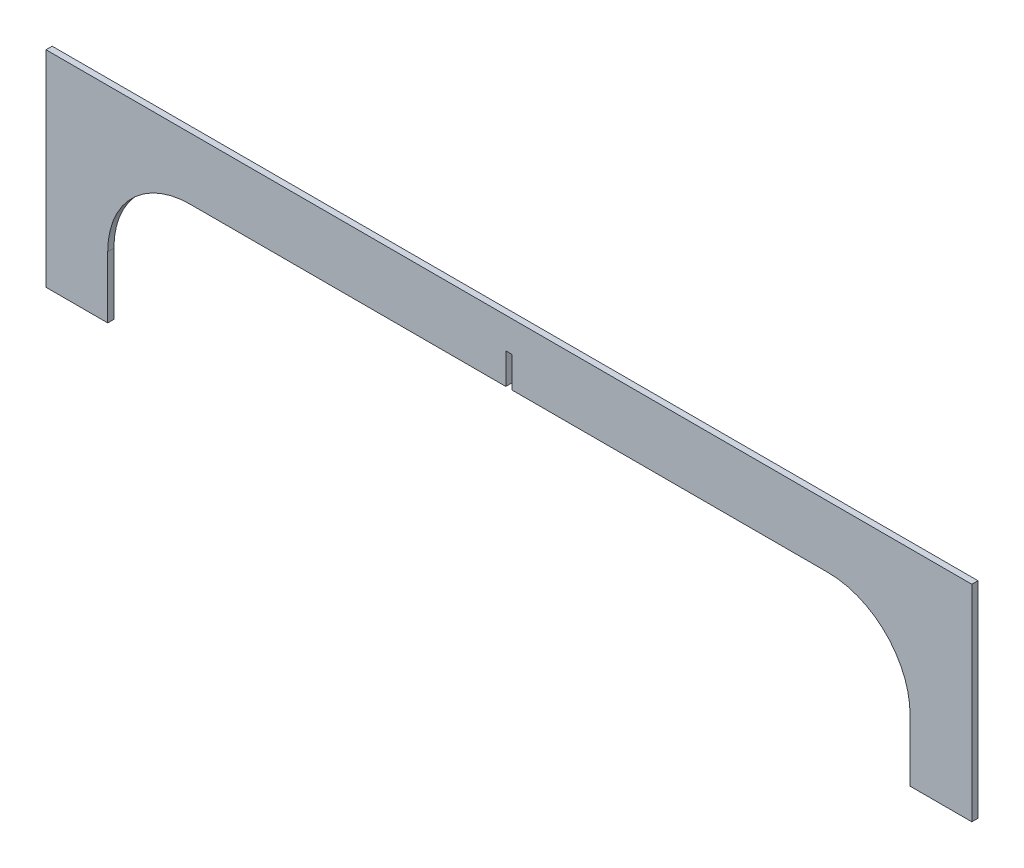
ISO-10303-21;
HEADER;
FILE_DESCRIPTION(('STEP AP214'),'2;1');
FILE_NAME('part.step','',(''),(''),'','','');
FILE_SCHEMA(('AUTOMOTIVE_DESIGN { 1 0 10303 214 1 1 1 1 }'));
ENDSEC;
DATA;
#1=APPLICATION_CONTEXT('core data for automotive mechanical design processes');
#2=APPLICATION_PROTOCOL_DEFINITION('international standard','automotive_design',2000,#1);
#3=PRODUCT_CONTEXT('',#1,'mechanical');
#4=PRODUCT('Part','Part','',(#3));
#5=PRODUCT_RELATED_PRODUCT_CATEGORY('part','',(#4));
#6=PRODUCT_DEFINITION_FORMATION('','',#4);
#7=PRODUCT_DEFINITION_CONTEXT('part definition',#1,'design');
#8=PRODUCT_DEFINITION('design','',#6,#7);
#9=PRODUCT_DEFINITION_SHAPE('','',#8);
#10=(LENGTH_UNIT() NAMED_UNIT(*) SI_UNIT(.MILLI.,.METRE.));
#11=(NAMED_UNIT(*) PLANE_ANGLE_UNIT() SI_UNIT($,.RADIAN.));
#12=(NAMED_UNIT(*) SI_UNIT($,.STERADIAN.) SOLID_ANGLE_UNIT());
#13=UNCERTAINTY_MEASURE_WITH_UNIT(LENGTH_MEASURE(1.E-05),#10,'distance_accuracy_value','');
#14=(GEOMETRIC_REPRESENTATION_CONTEXT(3) GLOBAL_UNCERTAINTY_ASSIGNED_CONTEXT((#13)) GLOBAL_UNIT_ASSIGNED_CONTEXT((#10,
#11,#12)) REPRESENTATION_CONTEXT('',''));
#15=CARTESIAN_POINT('',(0.,0.,0.));
#16=DIRECTION('',(0.,0.,1.));
#17=DIRECTION('',(1.,0.,0.));
#18=AXIS2_PLACEMENT_3D('',#15,#16,#17);
#19=CARTESIAN_POINT('',(30.,0.,3.));
#20=DIRECTION('',(0.,1.,0.));
#21=DIRECTION('',(-1.,0.,0.));
#22=AXIS2_PLACEMENT_3D('',#19,#20,#21);
#23=PLANE('',#22);
#24=DIRECTION('',(1.,0.,0.));
#25=VECTOR('',#24,1.);
#26=CARTESIAN_POINT('',(30.,0.,0.));
#27=LINE('',#26,#25);
#28=CARTESIAN_POINT('',(0.,0.,0.));
#29=VERTEX_POINT('',#28);
#30=CARTESIAN_POINT('',(30.,0.,0.));
#31=VERTEX_POINT('',#30);
#32=EDGE_CURVE('E153',#29,#31,#27,.T.);
#33=ORIENTED_EDGE('',*,*,#32,.T.);
#34=DIRECTION('',(0.,0.,-1.));
#35=VECTOR('',#34,1.);
#36=CARTESIAN_POINT('',(30.,0.,3.));
#37=LINE('',#36,#35);
#38=CARTESIAN_POINT('',(30.,0.,3.));
#39=VERTEX_POINT('',#38);
#40=EDGE_CURVE('E136',#39,#31,#37,.T.);
#41=ORIENTED_EDGE('',*,*,#40,.F.);
#42=DIRECTION('',(1.,0.,0.));
#43=VECTOR('',#42,1.);
#44=CARTESIAN_POINT('',(30.,0.,3.));
#45=LINE('',#44,#43);
#46=CARTESIAN_POINT('',(0.,0.,3.));
#47=VERTEX_POINT('',#46);
#48=EDGE_CURVE('E141',#47,#39,#45,.T.);
#49=ORIENTED_EDGE('',*,*,#48,.F.);
#50=DIRECTION('',(0.,0.,-1.));
#51=VECTOR('',#50,1.);
#52=CARTESIAN_POINT('',(0.,0.,3.));
#53=LINE('',#52,#51);
#54=EDGE_CURVE('E218',#47,#29,#53,.T.);
#55=ORIENTED_EDGE('',*,*,#54,.T.);
#56=EDGE_LOOP('',(#33,#41,#49,#55));
#57=FACE_BOUND('',#56,.T.);
#58=ADVANCED_FACE('F35',(#57),#23,.F.);
#59=CARTESIAN_POINT('',(30.,70.,3.));
#60=DIRECTION('',(-1.,0.,0.));
#61=DIRECTION('',(0.,-1.,0.));
#62=AXIS2_PLACEMENT_3D('',#59,#60,#61);
#63=PLANE('',#62);
#64=DIRECTION('',(0.,1.,0.));
#65=VECTOR('',#64,1.);
#66=CARTESIAN_POINT('',(30.,70.,0.));
#67=LINE('',#66,#65);
#68=CARTESIAN_POINT('',(30.,30.,0.));
#69=VERTEX_POINT('',#68);
#70=EDGE_CURVE('E249',#31,#69,#67,.T.);
#71=ORIENTED_EDGE('',*,*,#70,.T.);
#72=DIRECTION('',(0.,0.,-1.));
#73=VECTOR('',#72,1.);
#74=CARTESIAN_POINT('',(30.,30.,3.));
#75=LINE('',#74,#73);
#76=CARTESIAN_POINT('',(30.,30.,3.));
#77=VERTEX_POINT('',#76);
#78=EDGE_CURVE('E50',#69,#77,#75,.F.);
#79=ORIENTED_EDGE('',*,*,#78,.T.);
#80=DIRECTION('',(0.,1.,0.));
#81=VECTOR('',#80,1.);
#82=CARTESIAN_POINT('',(30.,70.,3.));
#83=LINE('',#82,#81);
#84=EDGE_CURVE('E132',#39,#77,#83,.T.);
#85=ORIENTED_EDGE('',*,*,#84,.F.);
#86=ORIENTED_EDGE('',*,*,#40,.T.);
#87=EDGE_LOOP('',(#71,#79,#85,#86));
#88=FACE_BOUND('',#87,.T.);
#89=ADVANCED_FACE('F134',(#88),#63,.F.);
#90=CARTESIAN_POINT('',(30.,70.,3.));
#91=DIRECTION('',(0.,1.,0.));
#92=DIRECTION('',(0.,0.,1.));
#93=AXIS2_PLACEMENT_3D('',#90,#91,#92);
#94=PLANE('',#93);
#95=DIRECTION('',(1.,0.,0.));
#96=VECTOR('',#95,1.);
#97=CARTESIAN_POINT('',(30.,70.,3.));
#98=LINE('',#97,#96);
#99=CARTESIAN_POINT('',(70.,70.,3.));
#100=VERTEX_POINT('',#99);
#101=CARTESIAN_POINT('',(223.5,70.,3.));
#102=VERTEX_POINT('',#101);
#103=EDGE_CURVE('E140',#100,#102,#98,.T.);
#104=ORIENTED_EDGE('',*,*,#103,.F.);
#105=DIRECTION('',(0.,0.,-1.));
#106=VECTOR('',#105,1.);
#107=CARTESIAN_POINT('',(70.,70.,0.));
#108=LINE('',#107,#106);
#109=CARTESIAN_POINT('',(70.,70.,0.));
#110=VERTEX_POINT('',#109);
#111=EDGE_CURVE('E166',#100,#110,#108,.T.);
#112=ORIENTED_EDGE('',*,*,#111,.T.);
#113=DIRECTION('',(1.,0.,0.));
#114=VECTOR('',#113,1.);
#115=CARTESIAN_POINT('',(30.,70.,0.));
#116=LINE('',#115,#114);
#117=CARTESIAN_POINT('',(223.5,70.,0.));
#118=VERTEX_POINT('',#117);
#119=EDGE_CURVE('E245',#110,#118,#116,.T.);
#120=ORIENTED_EDGE('',*,*,#119,.T.);
#121=DIRECTION('',(0.,0.,-1.));
#122=VECTOR('',#121,1.);
#123=CARTESIAN_POINT('',(223.5,70.,3.));
#124=LINE('',#123,#122);
#125=EDGE_CURVE('E155',#102,#118,#124,.T.);
#126=ORIENTED_EDGE('',*,*,#125,.F.);
#127=EDGE_LOOP('',(#104,#112,#120,#126));
#128=FACE_BOUND('',#127,.T.);
#129=ADVANCED_FACE('F268',(#128),#94,.F.);
#130=CARTESIAN_POINT('',(223.5,70.,3.));
#131=DIRECTION('',(-1.,0.,0.));
#132=DIRECTION('',(0.,0.,1.));
#133=AXIS2_PLACEMENT_3D('',#130,#131,#132);
#134=PLANE('',#133);
#135=DIRECTION('',(0.,1.,0.));
#136=VECTOR('',#135,1.);
#137=CARTESIAN_POINT('',(223.5,70.,0.));
#138=LINE('',#137,#136);
#139=CARTESIAN_POINT('',(223.5,85.,0.));
#140=VERTEX_POINT('',#139);
#141=EDGE_CURVE('E244',#118,#140,#138,.T.);
#142=ORIENTED_EDGE('',*,*,#141,.T.);
#143=DIRECTION('',(0.,0.,-1.));
#144=VECTOR('',#143,1.);
#145=CARTESIAN_POINT('',(223.5,85.,3.));
#146=LINE('',#145,#144);
#147=CARTESIAN_POINT('',(223.5,85.,3.));
#148=VERTEX_POINT('',#147);
#149=EDGE_CURVE('E161',#148,#140,#146,.T.);
#150=ORIENTED_EDGE('',*,*,#149,.F.);
#151=DIRECTION('',(0.,1.,0.));
#152=VECTOR('',#151,1.);
#153=CARTESIAN_POINT('',(223.5,70.,3.));
#154=LINE('',#153,#152);
#155=EDGE_CURVE('E262',#102,#148,#154,.T.);
#156=ORIENTED_EDGE('',*,*,#155,.F.);
#157=ORIENTED_EDGE('',*,*,#125,.T.);
#158=EDGE_LOOP('',(#142,#150,#156,#157));
#159=FACE_BOUND('',#158,.T.);
#160=ADVANCED_FACE('F269',(#159),#134,.F.);
#161=CARTESIAN_POINT('',(223.5,85.,3.));
#162=DIRECTION('',(0.,1.,0.));
#163=DIRECTION('',(0.,0.,1.));
#164=AXIS2_PLACEMENT_3D('',#161,#162,#163);
#165=PLANE('',#164);
#166=DIRECTION('',(1.,0.,0.));
#167=VECTOR('',#166,1.);
#168=CARTESIAN_POINT('',(223.5,85.,0.));
#169=LINE('',#168,#167);
#170=CARTESIAN_POINT('',(226.5,85.,0.));
#171=VERTEX_POINT('',#170);
#172=EDGE_CURVE('E208',#140,#171,#169,.T.);
#173=ORIENTED_EDGE('',*,*,#172,.T.);
#174=DIRECTION('',(0.,0.,-1.));
#175=VECTOR('',#174,1.);
#176=CARTESIAN_POINT('',(226.5,85.,3.));
#177=LINE('',#176,#175);
#178=CARTESIAN_POINT('',(226.5,85.,3.));
#179=VERTEX_POINT('',#178);
#180=EDGE_CURVE('E231',#179,#171,#177,.T.);
#181=ORIENTED_EDGE('',*,*,#180,.F.);
#182=DIRECTION('',(1.,0.,0.));
#183=VECTOR('',#182,1.);
#184=CARTESIAN_POINT('',(223.5,85.,3.));
#185=LINE('',#184,#183);
#186=EDGE_CURVE('E240',#148,#179,#185,.T.);
#187=ORIENTED_EDGE('',*,*,#186,.F.);
#188=ORIENTED_EDGE('',*,*,#149,.T.);
#189=EDGE_LOOP('',(#173,#181,#187,#188));
#190=FACE_BOUND('',#189,.T.);
#191=ADVANCED_FACE('F238',(#190),#165,.F.);
#192=CARTESIAN_POINT('',(226.5,85.,3.));
#193=DIRECTION('',(1.,0.,0.));
#194=DIRECTION('',(0.,0.,-1.));
#195=AXIS2_PLACEMENT_3D('',#192,#193,#194);
#196=PLANE('',#195);
#197=DIRECTION('',(0.,-1.,0.));
#198=VECTOR('',#197,1.);
#199=CARTESIAN_POINT('',(226.5,85.,0.));
#200=LINE('',#199,#198);
#201=CARTESIAN_POINT('',(226.5,70.,0.));
#202=VERTEX_POINT('',#201);
#203=EDGE_CURVE('E204',#171,#202,#200,.T.);
#204=ORIENTED_EDGE('',*,*,#203,.T.);
#205=DIRECTION('',(0.,0.,-1.));
#206=VECTOR('',#205,1.);
#207=CARTESIAN_POINT('',(226.5,70.,3.));
#208=LINE('',#207,#206);
#209=CARTESIAN_POINT('',(226.5,70.,3.));
#210=VERTEX_POINT('',#209);
#211=EDGE_CURVE('E203',#210,#202,#208,.T.);
#212=ORIENTED_EDGE('',*,*,#211,.F.);
#213=DIRECTION('',(0.,-1.,0.));
#214=VECTOR('',#213,1.);
#215=CARTESIAN_POINT('',(226.5,85.,3.));
#216=LINE('',#215,#214);
#217=EDGE_CURVE('E259',#179,#210,#216,.T.);
#218=ORIENTED_EDGE('',*,*,#217,.F.);
#219=ORIENTED_EDGE('',*,*,#180,.T.);
#220=EDGE_LOOP('',(#204,#212,#218,#219));
#221=FACE_BOUND('',#220,.T.);
#222=ADVANCED_FACE('F276',(#221),#196,.F.);
#223=CARTESIAN_POINT('',(226.5,70.,3.));
#224=DIRECTION('',(0.,1.,0.));
#225=DIRECTION('',(0.,0.,1.));
#226=AXIS2_PLACEMENT_3D('',#223,#224,#225);
#227=PLANE('',#226);
#228=DIRECTION('',(1.,0.,0.));
#229=VECTOR('',#228,1.);
#230=CARTESIAN_POINT('',(226.5,70.,0.));
#231=LINE('',#230,#229);
#232=CARTESIAN_POINT('',(380.,70.,0.));
#233=VERTEX_POINT('',#232);
#234=EDGE_CURVE('E196',#202,#233,#231,.T.);
#235=ORIENTED_EDGE('',*,*,#234,.T.);
#236=DIRECTION('',(0.,0.,-1.));
#237=VECTOR('',#236,1.);
#238=CARTESIAN_POINT('',(380.,70.,3.));
#239=LINE('',#238,#237);
#240=CARTESIAN_POINT('',(380.,70.,3.));
#241=VERTEX_POINT('',#240);
#242=EDGE_CURVE('E158',#233,#241,#239,.F.);
#243=ORIENTED_EDGE('',*,*,#242,.T.);
#244=DIRECTION('',(1.,0.,0.));
#245=VECTOR('',#244,1.);
#246=CARTESIAN_POINT('',(226.5,70.,3.));
#247=LINE('',#246,#245);
#248=EDGE_CURVE('E179',#210,#241,#247,.T.);
#249=ORIENTED_EDGE('',*,*,#248,.F.);
#250=ORIENTED_EDGE('',*,*,#211,.T.);
#251=EDGE_LOOP('',(#235,#243,#249,#250));
#252=FACE_BOUND('',#251,.T.);
#253=ADVANCED_FACE('F201',(#252),#227,.F.);
#254=CARTESIAN_POINT('',(420.,0.,3.));
#255=DIRECTION('',(1.,0.,0.));
#256=DIRECTION('',(0.,0.,-1.));
#257=AXIS2_PLACEMENT_3D('',#254,#255,#256);
#258=PLANE('',#257);
#259=DIRECTION('',(0.,-1.,0.));
#260=VECTOR('',#259,1.);
#261=CARTESIAN_POINT('',(420.,0.,3.));
#262=LINE('',#261,#260);
#263=CARTESIAN_POINT('',(420.,30.,3.));
#264=VERTEX_POINT('',#263);
#265=CARTESIAN_POINT('',(420.,0.,3.));
#266=VERTEX_POINT('',#265);
#267=EDGE_CURVE('E176',#264,#266,#262,.T.);
#268=ORIENTED_EDGE('',*,*,#267,.F.);
#269=DIRECTION('',(0.,0.,-1.));
#270=VECTOR('',#269,1.);
#271=CARTESIAN_POINT('',(420.,30.,0.));
#272=LINE('',#271,#270);
#273=CARTESIAN_POINT('',(420.,30.,0.));
#274=VERTEX_POINT('',#273);
#275=EDGE_CURVE('E154',#264,#274,#272,.T.);
#276=ORIENTED_EDGE('',*,*,#275,.T.);
#277=DIRECTION('',(0.,-1.,0.));
#278=VECTOR('',#277,1.);
#279=CARTESIAN_POINT('',(420.,0.,0.));
#280=LINE('',#279,#278);
#281=CARTESIAN_POINT('',(420.,0.,0.));
#282=VERTEX_POINT('',#281);
#283=EDGE_CURVE('E198',#274,#282,#280,.T.);
#284=ORIENTED_EDGE('',*,*,#283,.T.);
#285=DIRECTION('',(0.,0.,-1.));
#286=VECTOR('',#285,1.);
#287=CARTESIAN_POINT('',(420.,0.,3.));
#288=LINE('',#287,#286);
#289=EDGE_CURVE('E187',#266,#282,#288,.T.);
#290=ORIENTED_EDGE('',*,*,#289,.F.);
#291=EDGE_LOOP('',(#268,#276,#284,#290));
#292=FACE_BOUND('',#291,.T.);
#293=ADVANCED_FACE('F184',(#292),#258,.F.);
#294=CARTESIAN_POINT('',(450.,0.,3.));
#295=DIRECTION('',(0.,1.,0.));
#296=DIRECTION('',(-1.,0.,0.));
#297=AXIS2_PLACEMENT_3D('',#294,#295,#296);
#298=PLANE('',#297);
#299=DIRECTION('',(1.,0.,0.));
#300=VECTOR('',#299,1.);
#301=CARTESIAN_POINT('',(450.,0.,0.));
#302=LINE('',#301,#300);
#303=CARTESIAN_POINT('',(450.,0.,0.));
#304=VERTEX_POINT('',#303);
#305=EDGE_CURVE('E206',#282,#304,#302,.T.);
#306=ORIENTED_EDGE('',*,*,#305,.T.);
#307=DIRECTION('',(0.,0.,-1.));
#308=VECTOR('',#307,1.);
#309=CARTESIAN_POINT('',(450.,0.,3.));
#310=LINE('',#309,#308);
#311=CARTESIAN_POINT('',(450.,0.,3.));
#312=VERTEX_POINT('',#311);
#313=EDGE_CURVE('E226',#312,#304,#310,.T.);
#314=ORIENTED_EDGE('',*,*,#313,.F.);
#315=DIRECTION('',(1.,0.,0.));
#316=VECTOR('',#315,1.);
#317=CARTESIAN_POINT('',(450.,0.,3.));
#318=LINE('',#317,#316);
#319=EDGE_CURVE('E189',#266,#312,#318,.T.);
#320=ORIENTED_EDGE('',*,*,#319,.F.);
#321=ORIENTED_EDGE('',*,*,#289,.T.);
#322=EDGE_LOOP('',(#306,#314,#320,#321));
#323=FACE_BOUND('',#322,.T.);
#324=ADVANCED_FACE('F308',(#323),#298,.F.);
#325=CARTESIAN_POINT('',(450.,100.,3.));
#326=DIRECTION('',(-1.,0.,0.));
#327=DIRECTION('',(0.,0.,1.));
#328=AXIS2_PLACEMENT_3D('',#325,#326,#327);
#329=PLANE('',#328);
#330=DIRECTION('',(0.,1.,0.));
#331=VECTOR('',#330,1.);
#332=CARTESIAN_POINT('',(450.,100.,0.));
#333=LINE('',#332,#331);
#334=CARTESIAN_POINT('',(450.,100.,0.));
#335=VERTEX_POINT('',#334);
#336=EDGE_CURVE('E213',#304,#335,#333,.T.);
#337=ORIENTED_EDGE('',*,*,#336,.T.);
#338=DIRECTION('',(0.,0.,-1.));
#339=VECTOR('',#338,1.);
#340=CARTESIAN_POINT('',(450.,100.,3.));
#341=LINE('',#340,#339);
#342=CARTESIAN_POINT('',(450.,100.,3.));
#343=VERTEX_POINT('',#342);
#344=EDGE_CURVE('E223',#343,#335,#341,.T.);
#345=ORIENTED_EDGE('',*,*,#344,.F.);
#346=DIRECTION('',(0.,1.,0.));
#347=VECTOR('',#346,1.);
#348=CARTESIAN_POINT('',(450.,100.,3.));
#349=LINE('',#348,#347);
#350=EDGE_CURVE('E255',#312,#343,#349,.T.);
#351=ORIENTED_EDGE('',*,*,#350,.F.);
#352=ORIENTED_EDGE('',*,*,#313,.T.);
#353=EDGE_LOOP('',(#337,#345,#351,#352));
#354=FACE_BOUND('',#353,.T.);
#355=ADVANCED_FACE('F304',(#354),#329,.F.);
#356=CARTESIAN_POINT('',(0.,100.,3.));
#357=DIRECTION('',(0.,-1.,0.));
#358=DIRECTION('',(0.,0.,-1.));
#359=AXIS2_PLACEMENT_3D('',#356,#357,#358);
#360=PLANE('',#359);
#361=DIRECTION('',(-1.,0.,0.));
#362=VECTOR('',#361,1.);
#363=CARTESIAN_POINT('',(0.,100.,0.));
#364=LINE('',#363,#362);
#365=CARTESIAN_POINT('',(0.,100.,0.));
#366=VERTEX_POINT('',#365);
#367=EDGE_CURVE('E215',#335,#366,#364,.T.);
#368=ORIENTED_EDGE('',*,*,#367,.T.);
#369=DIRECTION('',(0.,0.,-1.));
#370=VECTOR('',#369,1.);
#371=CARTESIAN_POINT('',(0.,100.,3.));
#372=LINE('',#371,#370);
#373=CARTESIAN_POINT('',(0.,100.,3.));
#374=VERTEX_POINT('',#373);
#375=EDGE_CURVE('E220',#374,#366,#372,.T.);
#376=ORIENTED_EDGE('',*,*,#375,.F.);
#377=DIRECTION('',(-1.,0.,0.));
#378=VECTOR('',#377,1.);
#379=CARTESIAN_POINT('',(0.,100.,3.));
#380=LINE('',#379,#378);
#381=EDGE_CURVE('E253',#343,#374,#380,.T.);
#382=ORIENTED_EDGE('',*,*,#381,.F.);
#383=ORIENTED_EDGE('',*,*,#344,.T.);
#384=EDGE_LOOP('',(#368,#376,#382,#383));
#385=FACE_BOUND('',#384,.T.);
#386=ADVANCED_FACE('F300',(#385),#360,.F.);
#387=CARTESIAN_POINT('',(0.,0.,3.));
#388=DIRECTION('',(1.,0.,0.));
#389=DIRECTION('',(0.,0.,-1.));
#390=AXIS2_PLACEMENT_3D('',#387,#388,#389);
#391=PLANE('',#390);
#392=DIRECTION('',(0.,-1.,0.));
#393=VECTOR('',#392,1.);
#394=CARTESIAN_POINT('',(0.,0.,0.));
#395=LINE('',#394,#393);
#396=EDGE_CURVE('E150',#366,#29,#395,.T.);
#397=ORIENTED_EDGE('',*,*,#396,.T.);
#398=ORIENTED_EDGE('',*,*,#54,.F.);
#399=DIRECTION('',(0.,-1.,0.));
#400=VECTOR('',#399,1.);
#401=CARTESIAN_POINT('',(0.,0.,3.));
#402=LINE('',#401,#400);
#403=EDGE_CURVE('E146',#374,#47,#402,.T.);
#404=ORIENTED_EDGE('',*,*,#403,.F.);
#405=ORIENTED_EDGE('',*,*,#375,.T.);
#406=EDGE_LOOP('',(#397,#398,#404,#405));
#407=FACE_BOUND('',#406,.T.);
#408=ADVANCED_FACE('F295',(#407),#391,.F.);
#409=CARTESIAN_POINT('',(0.,0.,3.));
#410=DIRECTION('',(0.,0.,-1.));
#411=DIRECTION('',(-1.,0.,0.));
#412=AXIS2_PLACEMENT_3D('',#409,#410,#411);
#413=PLANE('',#412);
#414=ORIENTED_EDGE('',*,*,#48,.T.);
#415=ORIENTED_EDGE('',*,*,#84,.T.);
#416=CARTESIAN_POINT('',(70.,30.,3.));
#417=DIRECTION('',(0.,0.,-1.));
#418=DIRECTION('',(-1.,0.,0.));
#419=AXIS2_PLACEMENT_3D('',#416,#417,#418);
#420=CIRCLE('',#419,40.);
#421=EDGE_CURVE('E11',#77,#100,#420,.T.);
#422=ORIENTED_EDGE('',*,*,#421,.T.);
#423=ORIENTED_EDGE('',*,*,#103,.T.);
#424=ORIENTED_EDGE('',*,*,#155,.T.);
#425=ORIENTED_EDGE('',*,*,#186,.T.);
#426=ORIENTED_EDGE('',*,*,#217,.T.);
#427=ORIENTED_EDGE('',*,*,#248,.T.);
#428=CARTESIAN_POINT('',(380.,30.,3.));
#429=DIRECTION('',(0.,0.,-1.));
#430=DIRECTION('',(-1.,0.,0.));
#431=AXIS2_PLACEMENT_3D('',#428,#429,#430);
#432=CIRCLE('',#431,40.);
#433=EDGE_CURVE('E172',#241,#264,#432,.T.);
#434=ORIENTED_EDGE('',*,*,#433,.T.);
#435=ORIENTED_EDGE('',*,*,#267,.T.);
#436=ORIENTED_EDGE('',*,*,#319,.T.);
#437=ORIENTED_EDGE('',*,*,#350,.T.);
#438=ORIENTED_EDGE('',*,*,#381,.T.);
#439=ORIENTED_EDGE('',*,*,#403,.T.);
#440=EDGE_LOOP('',(#414,#415,#422,#423,#424,#425,#426,#427,#434,#435,#436,#437,#438,#439));
#441=FACE_BOUND('',#440,.T.);
#442=ADVANCED_FACE('F144',(#441),#413,.F.);
#443=CARTESIAN_POINT('',(0.,0.,0.));
#444=DIRECTION('',(0.,0.,-1.));
#445=DIRECTION('',(-1.,0.,0.));
#446=AXIS2_PLACEMENT_3D('',#443,#444,#445);
#447=PLANE('',#446);
#448=ORIENTED_EDGE('',*,*,#32,.F.);
#449=ORIENTED_EDGE('',*,*,#396,.F.);
#450=ORIENTED_EDGE('',*,*,#367,.F.);
#451=ORIENTED_EDGE('',*,*,#336,.F.);
#452=ORIENTED_EDGE('',*,*,#305,.F.);
#453=ORIENTED_EDGE('',*,*,#283,.F.);
#454=CARTESIAN_POINT('',(380.,30.,0.));
#455=DIRECTION('',(0.,0.,-1.));
#456=DIRECTION('',(-1.,0.,0.));
#457=AXIS2_PLACEMENT_3D('',#454,#455,#456);
#458=CIRCLE('',#457,40.);
#459=EDGE_CURVE('E170',#274,#233,#458,.F.);
#460=ORIENTED_EDGE('',*,*,#459,.T.);
#461=ORIENTED_EDGE('',*,*,#234,.F.);
#462=ORIENTED_EDGE('',*,*,#203,.F.);
#463=ORIENTED_EDGE('',*,*,#172,.F.);
#464=ORIENTED_EDGE('',*,*,#141,.F.);
#465=ORIENTED_EDGE('',*,*,#119,.F.);
#466=CARTESIAN_POINT('',(70.,30.,0.));
#467=DIRECTION('',(0.,0.,-1.));
#468=DIRECTION('',(-1.,0.,0.));
#469=AXIS2_PLACEMENT_3D('',#466,#467,#468);
#470=CIRCLE('',#469,40.);
#471=EDGE_CURVE('E43',#110,#69,#470,.F.);
#472=ORIENTED_EDGE('',*,*,#471,.T.);
#473=ORIENTED_EDGE('',*,*,#70,.F.);
#474=EDGE_LOOP('',(#448,#449,#450,#451,#452,#453,#460,#461,#462,#463,#464,#465,#472,#473));
#475=FACE_BOUND('',#474,.T.);
#476=ADVANCED_FACE('F194',(#475),#447,.T.);
#477=CARTESIAN_POINT('',(380.,30.,3.));
#478=DIRECTION('',(0.,0.,1.));
#479=DIRECTION('',(1.,0.,0.));
#480=AXIS2_PLACEMENT_3D('',#477,#478,#479);
#481=CYLINDRICAL_SURFACE('',#480,40.);
#482=ORIENTED_EDGE('',*,*,#433,.F.);
#483=ORIENTED_EDGE('',*,*,#242,.F.);
#484=ORIENTED_EDGE('',*,*,#459,.F.);
#485=ORIENTED_EDGE('',*,*,#275,.F.);
#486=EDGE_LOOP('',(#482,#483,#484,#485));
#487=FACE_BOUND('',#486,.T.);
#488=ADVANCED_FACE('F191',(#487),#481,.F.);
#489=CARTESIAN_POINT('',(70.,30.,3.));
#490=DIRECTION('',(0.,0.,1.));
#491=DIRECTION('',(1.,0.,0.));
#492=AXIS2_PLACEMENT_3D('',#489,#490,#491);
#493=CYLINDRICAL_SURFACE('',#492,40.);
#494=ORIENTED_EDGE('',*,*,#421,.F.);
#495=ORIENTED_EDGE('',*,*,#78,.F.);
#496=ORIENTED_EDGE('',*,*,#471,.F.);
#497=ORIENTED_EDGE('',*,*,#111,.F.);
#498=EDGE_LOOP('',(#494,#495,#496,#497));
#499=FACE_BOUND('',#498,.T.);
#500=ADVANCED_FACE('F37',(#499),#493,.F.);
#501=CLOSED_SHELL('',(#58,#89,#129,#160,#191,#222,#253,#293,#324,#355,#386,#408,#442,#476,#488,#500));
#502=MANIFOLD_SOLID_BREP('B2',#501);
#503=ADVANCED_BREP_SHAPE_REPRESENTATION('',(#18,#502),#14);
#504=SHAPE_DEFINITION_REPRESENTATION(#9,#503);
ENDSEC;
END-ISO-10303-21;
